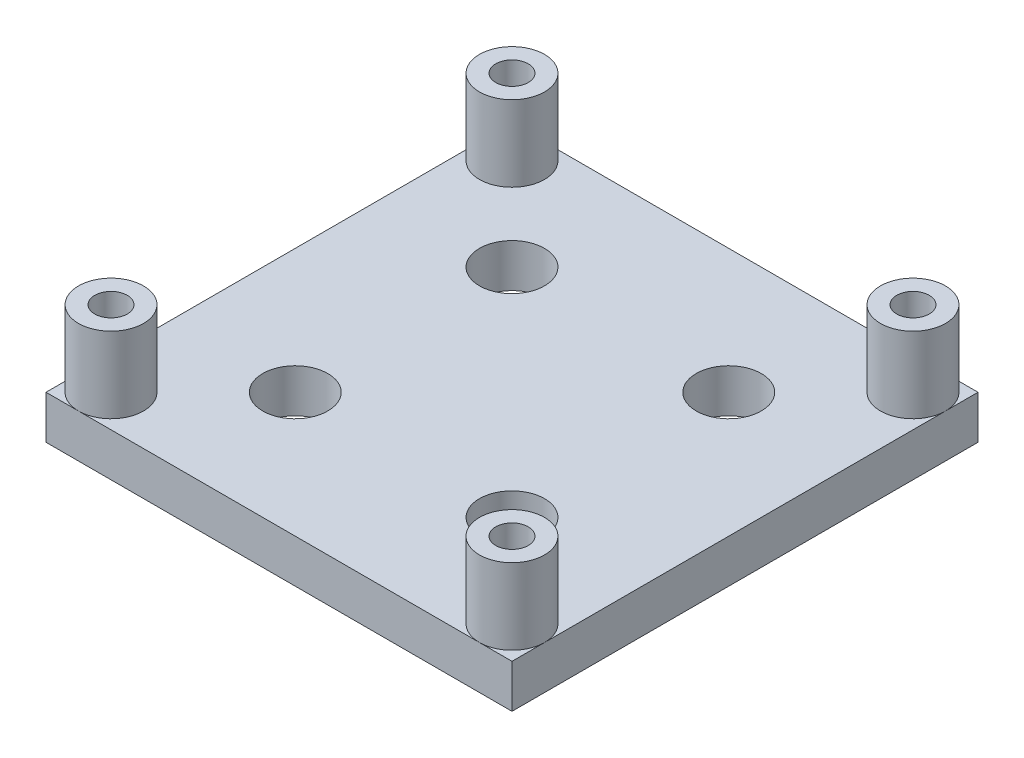
ISO-10303-21;
HEADER;
FILE_DESCRIPTION(('STEP AP214'),'2;1');
FILE_NAME('part.step','',(''),(''),'','','');
FILE_SCHEMA(('AUTOMOTIVE_DESIGN { 1 0 10303 214 1 1 1 1 }'));
ENDSEC;
DATA;
#1=APPLICATION_CONTEXT('core data for automotive mechanical design processes');
#2=APPLICATION_PROTOCOL_DEFINITION('international standard','automotive_design',2000,#1);
#3=PRODUCT_CONTEXT('',#1,'mechanical');
#4=PRODUCT('Part','Part','',(#3));
#5=PRODUCT_RELATED_PRODUCT_CATEGORY('part','',(#4));
#6=PRODUCT_DEFINITION_FORMATION('','',#4);
#7=PRODUCT_DEFINITION_CONTEXT('part definition',#1,'design');
#8=PRODUCT_DEFINITION('design','',#6,#7);
#9=PRODUCT_DEFINITION_SHAPE('','',#8);
#10=(LENGTH_UNIT() NAMED_UNIT(*) SI_UNIT(.MILLI.,.METRE.));
#11=(NAMED_UNIT(*) PLANE_ANGLE_UNIT() SI_UNIT($,.RADIAN.));
#12=(NAMED_UNIT(*) SI_UNIT($,.STERADIAN.) SOLID_ANGLE_UNIT());
#13=UNCERTAINTY_MEASURE_WITH_UNIT(LENGTH_MEASURE(1.E-05),#10,'distance_accuracy_value','');
#14=(GEOMETRIC_REPRESENTATION_CONTEXT(3) GLOBAL_UNCERTAINTY_ASSIGNED_CONTEXT((#13)) GLOBAL_UNIT_ASSIGNED_CONTEXT((#10,
#11,#12)) REPRESENTATION_CONTEXT('',''));
#15=CARTESIAN_POINT('',(0.,0.,0.));
#16=DIRECTION('',(0.,0.,1.));
#17=DIRECTION('',(1.,0.,0.));
#18=AXIS2_PLACEMENT_3D('',#15,#16,#17);
#19=CARTESIAN_POINT('',(0.,4.,0.));
#20=DIRECTION('',(0.,1.,0.));
#21=DIRECTION('',(0.,0.,1.));
#22=AXIS2_PLACEMENT_3D('',#19,#20,#21);
#23=PLANE('',#22);
#24=DIRECTION('',(0.,0.,1.));
#25=VECTOR('',#24,1.);
#26=CARTESIAN_POINT('',(-21.5,4.,-21.5));
#27=LINE('',#26,#25);
#28=CARTESIAN_POINT('',(-21.5,4.,-21.5));
#29=VERTEX_POINT('',#28);
#30=CARTESIAN_POINT('',(-21.5,4.,-18.5));
#31=VERTEX_POINT('',#30);
#32=EDGE_CURVE('E118',#29,#31,#27,.T.);
#33=ORIENTED_EDGE('',*,*,#32,.T.);
#34=CARTESIAN_POINT('',(-18.5,4.,-18.5));
#35=DIRECTION('',(0.,1.,0.));
#36=DIRECTION('',(0.,0.,1.));
#37=AXIS2_PLACEMENT_3D('',#34,#35,#36);
#38=CIRCLE('',#37,3.);
#39=CARTESIAN_POINT('',(-18.5,4.,-21.5));
#40=VERTEX_POINT('',#39);
#41=EDGE_CURVE('E57',#40,#31,#38,.T.);
#42=ORIENTED_EDGE('',*,*,#41,.F.);
#43=DIRECTION('',(-1.,0.,0.));
#44=VECTOR('',#43,1.);
#45=CARTESIAN_POINT('',(-21.5,4.,-21.5));
#46=LINE('',#45,#44);
#47=EDGE_CURVE('E115',#40,#29,#46,.T.);
#48=ORIENTED_EDGE('',*,*,#47,.T.);
#49=EDGE_LOOP('',(#33,#42,#48));
#50=FACE_BOUND('',#49,.T.);
#51=ADVANCED_FACE('F41',(#50),#23,.T.);
#52=CARTESIAN_POINT('',(9.99999999999545,4.,9.99999999999545));
#53=DIRECTION('',(0.,1.,0.));
#54=DIRECTION('',(0.,0.,1.));
#55=AXIS2_PLACEMENT_3D('',#52,#53,#54);
#56=CIRCLE('',#55,3.);
#57=CARTESIAN_POINT('',(9.99999999999545,4.,12.9999999999955));
#58=VERTEX_POINT('',#57);
#59=EDGE_CURVE('E266',#58,#58,#56,.T.);
#60=ORIENTED_EDGE('',*,*,#59,.F.);
#61=EDGE_LOOP('',(#60));
#62=FACE_BOUND('',#61,.T.);
#63=CARTESIAN_POINT('',(9.99999999999318,4.,-9.99999999999773));
#64=DIRECTION('',(0.,1.,0.));
#65=DIRECTION('',(0.,0.,1.));
#66=AXIS2_PLACEMENT_3D('',#63,#64,#65);
#67=CIRCLE('',#66,3.);
#68=CARTESIAN_POINT('',(9.99999999999318,4.,-6.99999999999773));
#69=VERTEX_POINT('',#68);
#70=EDGE_CURVE('E278',#69,#69,#67,.T.);
#71=ORIENTED_EDGE('',*,*,#70,.F.);
#72=EDGE_LOOP('',(#71));
#73=FACE_BOUND('',#72,.T.);
#74=CARTESIAN_POINT('',(-10.,4.,-9.99999999999999));
#75=DIRECTION('',(0.,1.,0.));
#76=DIRECTION('',(0.,0.,1.));
#77=AXIS2_PLACEMENT_3D('',#74,#75,#76);
#78=CIRCLE('',#77,3.);
#79=CARTESIAN_POINT('',(-10.,4.,-6.99999999999999));
#80=VERTEX_POINT('',#79);
#81=EDGE_CURVE('E149',#80,#80,#78,.T.);
#82=ORIENTED_EDGE('',*,*,#81,.F.);
#83=EDGE_LOOP('',(#82));
#84=FACE_BOUND('',#83,.T.);
#85=CARTESIAN_POINT('',(-9.9999999999903,4.,9.99999999999485));
#86=DIRECTION('',(0.,1.,0.));
#87=DIRECTION('',(0.,0.,1.));
#88=AXIS2_PLACEMENT_3D('',#85,#86,#87);
#89=CIRCLE('',#88,3.);
#90=CARTESIAN_POINT('',(-9.9999999999903,4.,12.9999999999949));
#91=VERTEX_POINT('',#90);
#92=EDGE_CURVE('E272',#91,#91,#89,.T.);
#93=ORIENTED_EDGE('',*,*,#92,.F.);
#94=EDGE_LOOP('',(#93));
#95=FACE_BOUND('',#94,.T.);
#96=CARTESIAN_POINT('',(18.5,4.,-21.5));
#97=VERTEX_POINT('',#96);
#98=EDGE_CURVE('E124',#97,#40,#46,.T.);
#99=ORIENTED_EDGE('',*,*,#98,.T.);
#100=EDGE_CURVE('E105',#31,#40,#38,.T.);
#101=ORIENTED_EDGE('',*,*,#100,.F.);
#102=CARTESIAN_POINT('',(-21.5,4.,18.5));
#103=VERTEX_POINT('',#102);
#104=EDGE_CURVE('E140',#31,#103,#27,.T.);
#105=ORIENTED_EDGE('',*,*,#104,.T.);
#106=CARTESIAN_POINT('',(-18.5,4.,18.5));
#107=DIRECTION('',(0.,1.,0.));
#108=DIRECTION('',(0.,0.,1.));
#109=AXIS2_PLACEMENT_3D('',#106,#107,#108);
#110=CIRCLE('',#109,2.99999999999999);
#111=CARTESIAN_POINT('',(-18.5,4.,21.5));
#112=VERTEX_POINT('',#111);
#113=EDGE_CURVE('E51',#112,#103,#110,.T.);
#114=ORIENTED_EDGE('',*,*,#113,.F.);
#115=DIRECTION('',(1.,0.,0.));
#116=VECTOR('',#115,1.);
#117=CARTESIAN_POINT('',(-21.5,4.,21.5));
#118=LINE('',#117,#116);
#119=CARTESIAN_POINT('',(18.5,4.,21.5));
#120=VERTEX_POINT('',#119);
#121=EDGE_CURVE('E144',#112,#120,#118,.T.);
#122=ORIENTED_EDGE('',*,*,#121,.T.);
#123=CARTESIAN_POINT('',(18.5,4.,18.5));
#124=DIRECTION('',(0.,1.,0.));
#125=DIRECTION('',(0.,0.,1.));
#126=AXIS2_PLACEMENT_3D('',#123,#124,#125);
#127=CIRCLE('',#126,3.);
#128=CARTESIAN_POINT('',(21.5,4.,18.5));
#129=VERTEX_POINT('',#128);
#130=EDGE_CURVE('E236',#129,#120,#127,.T.);
#131=ORIENTED_EDGE('',*,*,#130,.F.);
#132=DIRECTION('',(0.,0.,-1.));
#133=VECTOR('',#132,1.);
#134=CARTESIAN_POINT('',(21.5,4.,-21.5));
#135=LINE('',#134,#133);
#136=CARTESIAN_POINT('',(21.5,4.,-18.5));
#137=VERTEX_POINT('',#136);
#138=EDGE_CURVE('E235',#129,#137,#135,.T.);
#139=ORIENTED_EDGE('',*,*,#138,.T.);
#140=CARTESIAN_POINT('',(18.5,4.,-18.5));
#141=DIRECTION('',(0.,1.,0.));
#142=DIRECTION('',(0.,0.,1.));
#143=AXIS2_PLACEMENT_3D('',#140,#141,#142);
#144=CIRCLE('',#143,3.00000000000001);
#145=EDGE_CURVE('E133',#97,#137,#144,.T.);
#146=ORIENTED_EDGE('',*,*,#145,.F.);
#147=EDGE_LOOP('',(#99,#101,#105,#114,#122,#131,#139,#146));
#148=FACE_BOUND('',#147,.T.);
#149=ADVANCED_FACE('F131',(#62,#73,#84,#95,#148),#23,.T.);
#150=CARTESIAN_POINT('',(21.5,4.,-21.5));
#151=VERTEX_POINT('',#150);
#152=EDGE_CURVE('E130',#151,#97,#46,.T.);
#153=ORIENTED_EDGE('',*,*,#152,.T.);
#154=EDGE_CURVE('E64',#137,#97,#144,.T.);
#155=ORIENTED_EDGE('',*,*,#154,.F.);
#156=EDGE_CURVE('E155',#137,#151,#135,.T.);
#157=ORIENTED_EDGE('',*,*,#156,.T.);
#158=EDGE_LOOP('',(#153,#155,#157));
#159=FACE_BOUND('',#158,.T.);
#160=ADVANCED_FACE('F215',(#159),#23,.T.);
#161=CARTESIAN_POINT('',(21.5,4.,21.5));
#162=VERTEX_POINT('',#161);
#163=EDGE_CURVE('E128',#162,#129,#135,.T.);
#164=ORIENTED_EDGE('',*,*,#163,.T.);
#165=EDGE_CURVE('E233',#120,#129,#127,.T.);
#166=ORIENTED_EDGE('',*,*,#165,.F.);
#167=EDGE_CURVE('E139',#120,#162,#118,.T.);
#168=ORIENTED_EDGE('',*,*,#167,.T.);
#169=EDGE_LOOP('',(#164,#166,#168));
#170=FACE_BOUND('',#169,.T.);
#171=ADVANCED_FACE('F220',(#170),#23,.T.);
#172=EDGE_CURVE('E11',#103,#112,#110,.T.);
#173=ORIENTED_EDGE('',*,*,#172,.F.);
#174=CARTESIAN_POINT('',(-21.5,4.,21.5));
#175=VERTEX_POINT('',#174);
#176=EDGE_CURVE('E134',#103,#175,#27,.T.);
#177=ORIENTED_EDGE('',*,*,#176,.T.);
#178=EDGE_CURVE('E141',#175,#112,#118,.T.);
#179=ORIENTED_EDGE('',*,*,#178,.T.);
#180=EDGE_LOOP('',(#173,#177,#179));
#181=FACE_BOUND('',#180,.T.);
#182=ADVANCED_FACE('F185',(#181),#23,.T.);
#183=CARTESIAN_POINT('',(0.,0.,0.));
#184=DIRECTION('',(0.,1.,0.));
#185=DIRECTION('',(0.,0.,1.));
#186=AXIS2_PLACEMENT_3D('',#183,#184,#185);
#187=PLANE('',#186);
#188=DIRECTION('',(0.,0.,-1.));
#189=VECTOR('',#188,1.);
#190=CARTESIAN_POINT('',(21.5,0.,-21.5));
#191=LINE('',#190,#189);
#192=CARTESIAN_POINT('',(21.5,0.,21.5));
#193=VERTEX_POINT('',#192);
#194=CARTESIAN_POINT('',(21.5,0.,-21.5));
#195=VERTEX_POINT('',#194);
#196=EDGE_CURVE('E145',#193,#195,#191,.T.);
#197=ORIENTED_EDGE('',*,*,#196,.F.);
#198=DIRECTION('',(1.,0.,0.));
#199=VECTOR('',#198,1.);
#200=CARTESIAN_POINT('',(-21.5,0.,21.5));
#201=LINE('',#200,#199);
#202=CARTESIAN_POINT('',(-21.5,0.,21.5));
#203=VERTEX_POINT('',#202);
#204=EDGE_CURVE('E153',#203,#193,#201,.T.);
#205=ORIENTED_EDGE('',*,*,#204,.F.);
#206=DIRECTION('',(0.,0.,1.));
#207=VECTOR('',#206,1.);
#208=CARTESIAN_POINT('',(-21.5,0.,-21.5));
#209=LINE('',#208,#207);
#210=CARTESIAN_POINT('',(-21.5,0.,-21.5));
#211=VERTEX_POINT('',#210);
#212=EDGE_CURVE('E151',#211,#203,#209,.T.);
#213=ORIENTED_EDGE('',*,*,#212,.F.);
#214=DIRECTION('',(-1.,0.,0.));
#215=VECTOR('',#214,1.);
#216=CARTESIAN_POINT('',(-21.5,0.,-21.5));
#217=LINE('',#216,#215);
#218=EDGE_CURVE('E148',#195,#211,#217,.T.);
#219=ORIENTED_EDGE('',*,*,#218,.F.);
#220=EDGE_LOOP('',(#197,#205,#213,#219));
#221=FACE_BOUND('',#220,.T.);
#222=CARTESIAN_POINT('',(-10.,0.,-9.99999999999999));
#223=DIRECTION('',(0.,1.,0.));
#224=DIRECTION('',(0.,0.,1.));
#225=AXIS2_PLACEMENT_3D('',#222,#223,#224);
#226=CIRCLE('',#225,3.);
#227=CARTESIAN_POINT('',(-10.,0.,-6.99999999999999));
#228=VERTEX_POINT('',#227);
#229=EDGE_CURVE('E281',#228,#228,#226,.T.);
#230=ORIENTED_EDGE('',*,*,#229,.T.);
#231=EDGE_LOOP('',(#230));
#232=FACE_BOUND('',#231,.T.);
#233=CARTESIAN_POINT('',(9.99999999999318,0.,-9.99999999999773));
#234=DIRECTION('',(0.,1.,0.));
#235=DIRECTION('',(0.,0.,1.));
#236=AXIS2_PLACEMENT_3D('',#233,#234,#235);
#237=CIRCLE('',#236,3.);
#238=CARTESIAN_POINT('',(9.99999999999318,0.,-6.99999999999773));
#239=VERTEX_POINT('',#238);
#240=EDGE_CURVE('E275',#239,#239,#237,.T.);
#241=ORIENTED_EDGE('',*,*,#240,.T.);
#242=EDGE_LOOP('',(#241));
#243=FACE_BOUND('',#242,.T.);
#244=CARTESIAN_POINT('',(-9.9999999999903,0.,9.99999999999485));
#245=DIRECTION('',(0.,1.,0.));
#246=DIRECTION('',(0.,0.,1.));
#247=AXIS2_PLACEMENT_3D('',#244,#245,#246);
#248=CIRCLE('',#247,3.);
#249=CARTESIAN_POINT('',(-9.9999999999903,0.,12.9999999999949));
#250=VERTEX_POINT('',#249);
#251=EDGE_CURVE('E269',#250,#250,#248,.T.);
#252=ORIENTED_EDGE('',*,*,#251,.T.);
#253=EDGE_LOOP('',(#252));
#254=FACE_BOUND('',#253,.T.);
#255=CARTESIAN_POINT('',(9.99999999999545,0.,9.99999999999545));
#256=DIRECTION('',(0.,1.,0.));
#257=DIRECTION('',(0.,0.,1.));
#258=AXIS2_PLACEMENT_3D('',#255,#256,#257);
#259=CIRCLE('',#258,3.);
#260=CARTESIAN_POINT('',(9.99999999999545,0.,12.9999999999955));
#261=VERTEX_POINT('',#260);
#262=EDGE_CURVE('E265',#261,#261,#259,.T.);
#263=ORIENTED_EDGE('',*,*,#262,.T.);
#264=EDGE_LOOP('',(#263));
#265=FACE_BOUND('',#264,.T.);
#266=CARTESIAN_POINT('',(-18.5,0.,-18.5));
#267=DIRECTION('',(0.,1.,0.));
#268=DIRECTION('',(0.,0.,1.));
#269=AXIS2_PLACEMENT_3D('',#266,#267,#268);
#270=CIRCLE('',#269,1.5);
#271=CARTESIAN_POINT('',(-18.5,0.,-17.));
#272=VERTEX_POINT('',#271);
#273=EDGE_CURVE('E262',#272,#272,#270,.T.);
#274=ORIENTED_EDGE('',*,*,#273,.T.);
#275=EDGE_LOOP('',(#274));
#276=FACE_BOUND('',#275,.T.);
#277=CARTESIAN_POINT('',(18.5,0.,-18.5));
#278=DIRECTION('',(0.,1.,0.));
#279=DIRECTION('',(0.,0.,1.));
#280=AXIS2_PLACEMENT_3D('',#277,#278,#279);
#281=CIRCLE('',#280,1.5);
#282=CARTESIAN_POINT('',(18.5,0.,-17.));
#283=VERTEX_POINT('',#282);
#284=EDGE_CURVE('E259',#283,#283,#281,.T.);
#285=ORIENTED_EDGE('',*,*,#284,.T.);
#286=EDGE_LOOP('',(#285));
#287=FACE_BOUND('',#286,.T.);
#288=CARTESIAN_POINT('',(18.5,0.,18.5));
#289=DIRECTION('',(0.,1.,0.));
#290=DIRECTION('',(0.,0.,1.));
#291=AXIS2_PLACEMENT_3D('',#288,#289,#290);
#292=CIRCLE('',#291,1.5);
#293=CARTESIAN_POINT('',(18.5,0.,20.));
#294=VERTEX_POINT('',#293);
#295=EDGE_CURVE('E256',#294,#294,#292,.T.);
#296=ORIENTED_EDGE('',*,*,#295,.T.);
#297=EDGE_LOOP('',(#296));
#298=FACE_BOUND('',#297,.T.);
#299=CARTESIAN_POINT('',(-18.5,0.,18.5));
#300=DIRECTION('',(0.,1.,0.));
#301=DIRECTION('',(0.,0.,1.));
#302=AXIS2_PLACEMENT_3D('',#299,#300,#301);
#303=CIRCLE('',#302,1.5);
#304=CARTESIAN_POINT('',(-18.5,0.,20.));
#305=VERTEX_POINT('',#304);
#306=EDGE_CURVE('E252',#305,#305,#303,.T.);
#307=ORIENTED_EDGE('',*,*,#306,.T.);
#308=EDGE_LOOP('',(#307));
#309=FACE_BOUND('',#308,.T.);
#310=ADVANCED_FACE('F171',(#221,#232,#243,#254,#265,#276,#287,#298,#309),#187,.F.);
#311=CARTESIAN_POINT('',(21.5,4.,-21.5));
#312=DIRECTION('',(-1.,0.,0.));
#313=DIRECTION('',(0.,0.,1.));
#314=AXIS2_PLACEMENT_3D('',#311,#312,#313);
#315=PLANE('',#314);
#316=ORIENTED_EDGE('',*,*,#196,.T.);
#317=DIRECTION('',(0.,-1.,0.));
#318=VECTOR('',#317,1.);
#319=CARTESIAN_POINT('',(21.5,4.,-21.5));
#320=LINE('',#319,#318);
#321=EDGE_CURVE('E45',#151,#195,#320,.T.);
#322=ORIENTED_EDGE('',*,*,#321,.F.);
#323=ORIENTED_EDGE('',*,*,#156,.F.);
#324=ORIENTED_EDGE('',*,*,#138,.F.);
#325=ORIENTED_EDGE('',*,*,#163,.F.);
#326=DIRECTION('',(0.,-1.,0.));
#327=VECTOR('',#326,1.);
#328=CARTESIAN_POINT('',(21.5,4.,21.5));
#329=LINE('',#328,#327);
#330=EDGE_CURVE('E143',#162,#193,#329,.T.);
#331=ORIENTED_EDGE('',*,*,#330,.T.);
#332=EDGE_LOOP('',(#316,#322,#323,#324,#325,#331));
#333=FACE_BOUND('',#332,.T.);
#334=ADVANCED_FACE('F43',(#333),#315,.F.);
#335=CARTESIAN_POINT('',(-21.5,4.,-21.5));
#336=DIRECTION('',(0.,0.,1.));
#337=DIRECTION('',(1.,0.,0.));
#338=AXIS2_PLACEMENT_3D('',#335,#336,#337);
#339=PLANE('',#338);
#340=ORIENTED_EDGE('',*,*,#218,.T.);
#341=DIRECTION('',(0.,-1.,0.));
#342=VECTOR('',#341,1.);
#343=CARTESIAN_POINT('',(-21.5,4.,-21.5));
#344=LINE('',#343,#342);
#345=EDGE_CURVE('E127',#29,#211,#344,.T.);
#346=ORIENTED_EDGE('',*,*,#345,.F.);
#347=ORIENTED_EDGE('',*,*,#47,.F.);
#348=ORIENTED_EDGE('',*,*,#98,.F.);
#349=ORIENTED_EDGE('',*,*,#152,.F.);
#350=ORIENTED_EDGE('',*,*,#321,.T.);
#351=EDGE_LOOP('',(#340,#346,#347,#348,#349,#350));
#352=FACE_BOUND('',#351,.T.);
#353=ADVANCED_FACE('F122',(#352),#339,.F.);
#354=CARTESIAN_POINT('',(-21.5,4.,-21.5));
#355=DIRECTION('',(1.,0.,0.));
#356=DIRECTION('',(0.,0.,-1.));
#357=AXIS2_PLACEMENT_3D('',#354,#355,#356);
#358=PLANE('',#357);
#359=ORIENTED_EDGE('',*,*,#212,.T.);
#360=DIRECTION('',(0.,-1.,0.));
#361=VECTOR('',#360,1.);
#362=CARTESIAN_POINT('',(-21.5,4.,21.5));
#363=LINE('',#362,#361);
#364=EDGE_CURVE('E158',#175,#203,#363,.T.);
#365=ORIENTED_EDGE('',*,*,#364,.F.);
#366=ORIENTED_EDGE('',*,*,#176,.F.);
#367=ORIENTED_EDGE('',*,*,#104,.F.);
#368=ORIENTED_EDGE('',*,*,#32,.F.);
#369=ORIENTED_EDGE('',*,*,#345,.T.);
#370=EDGE_LOOP('',(#359,#365,#366,#367,#368,#369));
#371=FACE_BOUND('',#370,.T.);
#372=ADVANCED_FACE('F174',(#371),#358,.F.);
#373=CARTESIAN_POINT('',(-21.5,4.,21.5));
#374=DIRECTION('',(0.,0.,-1.));
#375=DIRECTION('',(-1.,0.,0.));
#376=AXIS2_PLACEMENT_3D('',#373,#374,#375);
#377=PLANE('',#376);
#378=ORIENTED_EDGE('',*,*,#204,.T.);
#379=ORIENTED_EDGE('',*,*,#330,.F.);
#380=ORIENTED_EDGE('',*,*,#167,.F.);
#381=ORIENTED_EDGE('',*,*,#121,.F.);
#382=ORIENTED_EDGE('',*,*,#178,.F.);
#383=ORIENTED_EDGE('',*,*,#364,.T.);
#384=EDGE_LOOP('',(#378,#379,#380,#381,#382,#383));
#385=FACE_BOUND('',#384,.T.);
#386=ADVANCED_FACE('F178',(#385),#377,.F.);
#387=CARTESIAN_POINT('',(-10.,4.,-9.99999999999999));
#388=DIRECTION('',(0.,-1.,0.));
#389=DIRECTION('',(0.,0.,-1.));
#390=AXIS2_PLACEMENT_3D('',#387,#388,#389);
#391=CYLINDRICAL_SURFACE('',#390,3.);
#392=ORIENTED_EDGE('',*,*,#81,.T.);
#393=EDGE_LOOP('',(#392));
#394=FACE_BOUND('',#393,.T.);
#395=ORIENTED_EDGE('',*,*,#229,.F.);
#396=EDGE_LOOP('',(#395));
#397=FACE_BOUND('',#396,.T.);
#398=ADVANCED_FACE('F289',(#394,#397),#391,.F.);
#399=CARTESIAN_POINT('',(9.99999999999318,4.,-9.99999999999773));
#400=DIRECTION('',(0.,-1.,0.));
#401=DIRECTION('',(0.,0.,-1.));
#402=AXIS2_PLACEMENT_3D('',#399,#400,#401);
#403=CYLINDRICAL_SURFACE('',#402,3.);
#404=ORIENTED_EDGE('',*,*,#70,.T.);
#405=EDGE_LOOP('',(#404));
#406=FACE_BOUND('',#405,.T.);
#407=ORIENTED_EDGE('',*,*,#240,.F.);
#408=EDGE_LOOP('',(#407));
#409=FACE_BOUND('',#408,.T.);
#410=ADVANCED_FACE('F291',(#406,#409),#403,.F.);
#411=CARTESIAN_POINT('',(-9.9999999999903,4.,9.99999999999485));
#412=DIRECTION('',(0.,-1.,0.));
#413=DIRECTION('',(0.,0.,-1.));
#414=AXIS2_PLACEMENT_3D('',#411,#412,#413);
#415=CYLINDRICAL_SURFACE('',#414,3.);
#416=ORIENTED_EDGE('',*,*,#92,.T.);
#417=EDGE_LOOP('',(#416));
#418=FACE_BOUND('',#417,.T.);
#419=ORIENTED_EDGE('',*,*,#251,.F.);
#420=EDGE_LOOP('',(#419));
#421=FACE_BOUND('',#420,.T.);
#422=ADVANCED_FACE('F296',(#418,#421),#415,.F.);
#423=CARTESIAN_POINT('',(9.99999999999545,4.,9.99999999999545));
#424=DIRECTION('',(0.,-1.,0.));
#425=DIRECTION('',(0.,0.,-1.));
#426=AXIS2_PLACEMENT_3D('',#423,#424,#425);
#427=CYLINDRICAL_SURFACE('',#426,3.);
#428=ORIENTED_EDGE('',*,*,#59,.T.);
#429=EDGE_LOOP('',(#428));
#430=FACE_BOUND('',#429,.T.);
#431=ORIENTED_EDGE('',*,*,#262,.F.);
#432=EDGE_LOOP('',(#431));
#433=FACE_BOUND('',#432,.T.);
#434=ADVANCED_FACE('F304',(#430,#433),#427,.F.);
#435=CARTESIAN_POINT('',(-18.5,4.,-18.5));
#436=DIRECTION('',(0.,-1.,0.));
#437=DIRECTION('',(0.,0.,-1.));
#438=AXIS2_PLACEMENT_3D('',#435,#436,#437);
#439=CYLINDRICAL_SURFACE('',#438,1.5);
#440=ORIENTED_EDGE('',*,*,#273,.F.);
#441=EDGE_LOOP('',(#440));
#442=FACE_BOUND('',#441,.T.);
#443=CARTESIAN_POINT('',(-18.5,11.,-18.5));
#444=DIRECTION('',(0.,1.,0.));
#445=DIRECTION('',(0.,0.,1.));
#446=AXIS2_PLACEMENT_3D('',#443,#444,#445);
#447=CIRCLE('',#446,1.5);
#448=CARTESIAN_POINT('',(-18.5,11.,-17.));
#449=VERTEX_POINT('',#448);
#450=EDGE_CURVE('E119',#449,#449,#447,.T.);
#451=ORIENTED_EDGE('',*,*,#450,.T.);
#452=EDGE_LOOP('',(#451));
#453=FACE_BOUND('',#452,.T.);
#454=ADVANCED_FACE('F307',(#442,#453),#439,.F.);
#455=CARTESIAN_POINT('',(18.5,4.,-18.5));
#456=DIRECTION('',(0.,-1.,0.));
#457=DIRECTION('',(0.,0.,-1.));
#458=AXIS2_PLACEMENT_3D('',#455,#456,#457);
#459=CYLINDRICAL_SURFACE('',#458,1.5);
#460=ORIENTED_EDGE('',*,*,#284,.F.);
#461=EDGE_LOOP('',(#460));
#462=FACE_BOUND('',#461,.T.);
#463=CARTESIAN_POINT('',(18.5,11.,-18.5));
#464=DIRECTION('',(0.,1.,0.));
#465=DIRECTION('',(0.,0.,1.));
#466=AXIS2_PLACEMENT_3D('',#463,#464,#465);
#467=CIRCLE('',#466,1.5);
#468=CARTESIAN_POINT('',(18.5,11.,-17.));
#469=VERTEX_POINT('',#468);
#470=EDGE_CURVE('E242',#469,#469,#467,.T.);
#471=ORIENTED_EDGE('',*,*,#470,.T.);
#472=EDGE_LOOP('',(#471));
#473=FACE_BOUND('',#472,.T.);
#474=ADVANCED_FACE('F311',(#462,#473),#459,.F.);
#475=CARTESIAN_POINT('',(18.5,4.,18.5));
#476=DIRECTION('',(0.,-1.,0.));
#477=DIRECTION('',(0.,0.,-1.));
#478=AXIS2_PLACEMENT_3D('',#475,#476,#477);
#479=CYLINDRICAL_SURFACE('',#478,1.5);
#480=ORIENTED_EDGE('',*,*,#295,.F.);
#481=EDGE_LOOP('',(#480));
#482=FACE_BOUND('',#481,.T.);
#483=CARTESIAN_POINT('',(18.5,11.,18.5));
#484=DIRECTION('',(0.,1.,0.));
#485=DIRECTION('',(0.,0.,1.));
#486=AXIS2_PLACEMENT_3D('',#483,#484,#485);
#487=CIRCLE('',#486,1.5);
#488=CARTESIAN_POINT('',(18.5,11.,20.));
#489=VERTEX_POINT('',#488);
#490=EDGE_CURVE('E240',#489,#489,#487,.T.);
#491=ORIENTED_EDGE('',*,*,#490,.T.);
#492=EDGE_LOOP('',(#491));
#493=FACE_BOUND('',#492,.T.);
#494=ADVANCED_FACE('F315',(#482,#493),#479,.F.);
#495=CARTESIAN_POINT('',(-18.5,4.,18.5));
#496=DIRECTION('',(0.,-1.,0.));
#497=DIRECTION('',(0.,0.,-1.));
#498=AXIS2_PLACEMENT_3D('',#495,#496,#497);
#499=CYLINDRICAL_SURFACE('',#498,1.5);
#500=ORIENTED_EDGE('',*,*,#306,.F.);
#501=EDGE_LOOP('',(#500));
#502=FACE_BOUND('',#501,.T.);
#503=CARTESIAN_POINT('',(-18.5,11.,18.5));
#504=DIRECTION('',(0.,1.,0.));
#505=DIRECTION('',(0.,0.,1.));
#506=AXIS2_PLACEMENT_3D('',#503,#504,#505);
#507=CIRCLE('',#506,1.5);
#508=CARTESIAN_POINT('',(-18.5,11.,20.));
#509=VERTEX_POINT('',#508);
#510=EDGE_CURVE('E190',#509,#509,#507,.T.);
#511=ORIENTED_EDGE('',*,*,#510,.T.);
#512=EDGE_LOOP('',(#511));
#513=FACE_BOUND('',#512,.T.);
#514=ADVANCED_FACE('F204',(#502,#513),#499,.F.);
#515=CARTESIAN_POINT('',(-18.5,11.,18.5));
#516=DIRECTION('',(0.,1.,0.));
#517=DIRECTION('',(0.,0.,1.));
#518=AXIS2_PLACEMENT_3D('',#515,#516,#517);
#519=PLANE('',#518);
#520=CARTESIAN_POINT('',(-18.5,11.,18.5));
#521=DIRECTION('',(0.,1.,0.));
#522=DIRECTION('',(0.,0.,1.));
#523=AXIS2_PLACEMENT_3D('',#520,#521,#522);
#524=CIRCLE('',#523,2.99999999999999);
#525=CARTESIAN_POINT('',(-18.5,11.,21.5));
#526=VERTEX_POINT('',#525);
#527=EDGE_CURVE('E189',#526,#526,#524,.T.);
#528=ORIENTED_EDGE('',*,*,#527,.T.);
#529=EDGE_LOOP('',(#528));
#530=FACE_BOUND('',#529,.T.);
#531=ORIENTED_EDGE('',*,*,#510,.F.);
#532=EDGE_LOOP('',(#531));
#533=FACE_BOUND('',#532,.T.);
#534=ADVANCED_FACE('F194',(#530,#533),#519,.T.);
#535=CARTESIAN_POINT('',(-18.5,11.,18.5));
#536=DIRECTION('',(0.,-1.,0.));
#537=DIRECTION('',(0.,0.,-1.));
#538=AXIS2_PLACEMENT_3D('',#535,#536,#537);
#539=CYLINDRICAL_SURFACE('',#538,2.99999999999999);
#540=ORIENTED_EDGE('',*,*,#527,.F.);
#541=EDGE_LOOP('',(#540));
#542=FACE_BOUND('',#541,.T.);
#543=ORIENTED_EDGE('',*,*,#113,.T.);
#544=ORIENTED_EDGE('',*,*,#172,.T.);
#545=EDGE_LOOP('',(#543,#544));
#546=FACE_BOUND('',#545,.T.);
#547=ADVANCED_FACE('F191',(#542,#546),#539,.T.);
#548=CARTESIAN_POINT('',(18.5,11.,18.5));
#549=DIRECTION('',(0.,1.,0.));
#550=DIRECTION('',(0.,0.,1.));
#551=AXIS2_PLACEMENT_3D('',#548,#549,#550);
#552=PLANE('',#551);
#553=CARTESIAN_POINT('',(18.5,11.,18.5));
#554=DIRECTION('',(0.,1.,0.));
#555=DIRECTION('',(0.,0.,1.));
#556=AXIS2_PLACEMENT_3D('',#553,#554,#555);
#557=CIRCLE('',#556,3.);
#558=CARTESIAN_POINT('',(18.5,11.,21.5));
#559=VERTEX_POINT('',#558);
#560=EDGE_CURVE('E238',#559,#559,#557,.T.);
#561=ORIENTED_EDGE('',*,*,#560,.T.);
#562=EDGE_LOOP('',(#561));
#563=FACE_BOUND('',#562,.T.);
#564=ORIENTED_EDGE('',*,*,#490,.F.);
#565=EDGE_LOOP('',(#564));
#566=FACE_BOUND('',#565,.T.);
#567=ADVANCED_FACE('F193',(#563,#566),#552,.T.);
#568=CARTESIAN_POINT('',(18.5,11.,18.5));
#569=DIRECTION('',(0.,-1.,0.));
#570=DIRECTION('',(0.,0.,-1.));
#571=AXIS2_PLACEMENT_3D('',#568,#569,#570);
#572=CYLINDRICAL_SURFACE('',#571,3.);
#573=ORIENTED_EDGE('',*,*,#560,.F.);
#574=EDGE_LOOP('',(#573));
#575=FACE_BOUND('',#574,.T.);
#576=ORIENTED_EDGE('',*,*,#165,.T.);
#577=ORIENTED_EDGE('',*,*,#130,.T.);
#578=EDGE_LOOP('',(#576,#577));
#579=FACE_BOUND('',#578,.T.);
#580=ADVANCED_FACE('F201',(#575,#579),#572,.T.);
#581=CARTESIAN_POINT('',(18.5,11.,-18.5));
#582=DIRECTION('',(0.,1.,0.));
#583=DIRECTION('',(0.,0.,1.));
#584=AXIS2_PLACEMENT_3D('',#581,#582,#583);
#585=PLANE('',#584);
#586=CARTESIAN_POINT('',(18.5,11.,-18.5));
#587=DIRECTION('',(0.,1.,0.));
#588=DIRECTION('',(0.,0.,1.));
#589=AXIS2_PLACEMENT_3D('',#586,#587,#588);
#590=CIRCLE('',#589,3.00000000000001);
#591=CARTESIAN_POINT('',(18.5,11.,-15.5));
#592=VERTEX_POINT('',#591);
#593=EDGE_CURVE('E404',#592,#592,#590,.T.);
#594=ORIENTED_EDGE('',*,*,#593,.T.);
#595=EDGE_LOOP('',(#594));
#596=FACE_BOUND('',#595,.T.);
#597=ORIENTED_EDGE('',*,*,#470,.F.);
#598=EDGE_LOOP('',(#597));
#599=FACE_BOUND('',#598,.T.);
#600=ADVANCED_FACE('F356',(#596,#599),#585,.T.);
#601=CARTESIAN_POINT('',(18.5,11.,-18.5));
#602=DIRECTION('',(0.,-1.,0.));
#603=DIRECTION('',(0.,0.,-1.));
#604=AXIS2_PLACEMENT_3D('',#601,#602,#603);
#605=CYLINDRICAL_SURFACE('',#604,3.00000000000001);
#606=ORIENTED_EDGE('',*,*,#593,.F.);
#607=EDGE_LOOP('',(#606));
#608=FACE_BOUND('',#607,.T.);
#609=ORIENTED_EDGE('',*,*,#154,.T.);
#610=ORIENTED_EDGE('',*,*,#145,.T.);
#611=EDGE_LOOP('',(#609,#610));
#612=FACE_BOUND('',#611,.T.);
#613=ADVANCED_FACE('F366',(#608,#612),#605,.T.);
#614=CARTESIAN_POINT('',(-18.5,11.,-18.5));
#615=DIRECTION('',(0.,1.,0.));
#616=DIRECTION('',(0.,0.,1.));
#617=AXIS2_PLACEMENT_3D('',#614,#615,#616);
#618=PLANE('',#617);
#619=CARTESIAN_POINT('',(-18.5,11.,-18.5));
#620=DIRECTION('',(0.,1.,0.));
#621=DIRECTION('',(0.,0.,1.));
#622=AXIS2_PLACEMENT_3D('',#619,#620,#621);
#623=CIRCLE('',#622,3.);
#624=CARTESIAN_POINT('',(-18.5,11.,-15.5));
#625=VERTEX_POINT('',#624);
#626=EDGE_CURVE('E110',#625,#625,#623,.T.);
#627=ORIENTED_EDGE('',*,*,#626,.T.);
#628=EDGE_LOOP('',(#627));
#629=FACE_BOUND('',#628,.T.);
#630=ORIENTED_EDGE('',*,*,#450,.F.);
#631=EDGE_LOOP('',(#630));
#632=FACE_BOUND('',#631,.T.);
#633=ADVANCED_FACE('F376',(#629,#632),#618,.T.);
#634=CARTESIAN_POINT('',(-18.5,11.,-18.5));
#635=DIRECTION('',(0.,-1.,0.));
#636=DIRECTION('',(0.,0.,-1.));
#637=AXIS2_PLACEMENT_3D('',#634,#635,#636);
#638=CYLINDRICAL_SURFACE('',#637,3.);
#639=ORIENTED_EDGE('',*,*,#626,.F.);
#640=EDGE_LOOP('',(#639));
#641=FACE_BOUND('',#640,.T.);
#642=ORIENTED_EDGE('',*,*,#41,.T.);
#643=ORIENTED_EDGE('',*,*,#100,.T.);
#644=EDGE_LOOP('',(#642,#643));
#645=FACE_BOUND('',#644,.T.);
#646=ADVANCED_FACE('F106',(#641,#645),#638,.T.);
#647=CLOSED_SHELL('',(#51,#149,#160,#171,#182,#310,#334,#353,#372,#386,#398,#410,#422,#434,#454,
#474,#494,#514,#534,#547,#567,#580,#600,#613,#633,#646));
#648=MANIFOLD_SOLID_BREP('B2',#647);
#649=ADVANCED_BREP_SHAPE_REPRESENTATION('',(#18,#648),#14);
#650=SHAPE_DEFINITION_REPRESENTATION(#9,#649);
ENDSEC;
END-ISO-10303-21;
